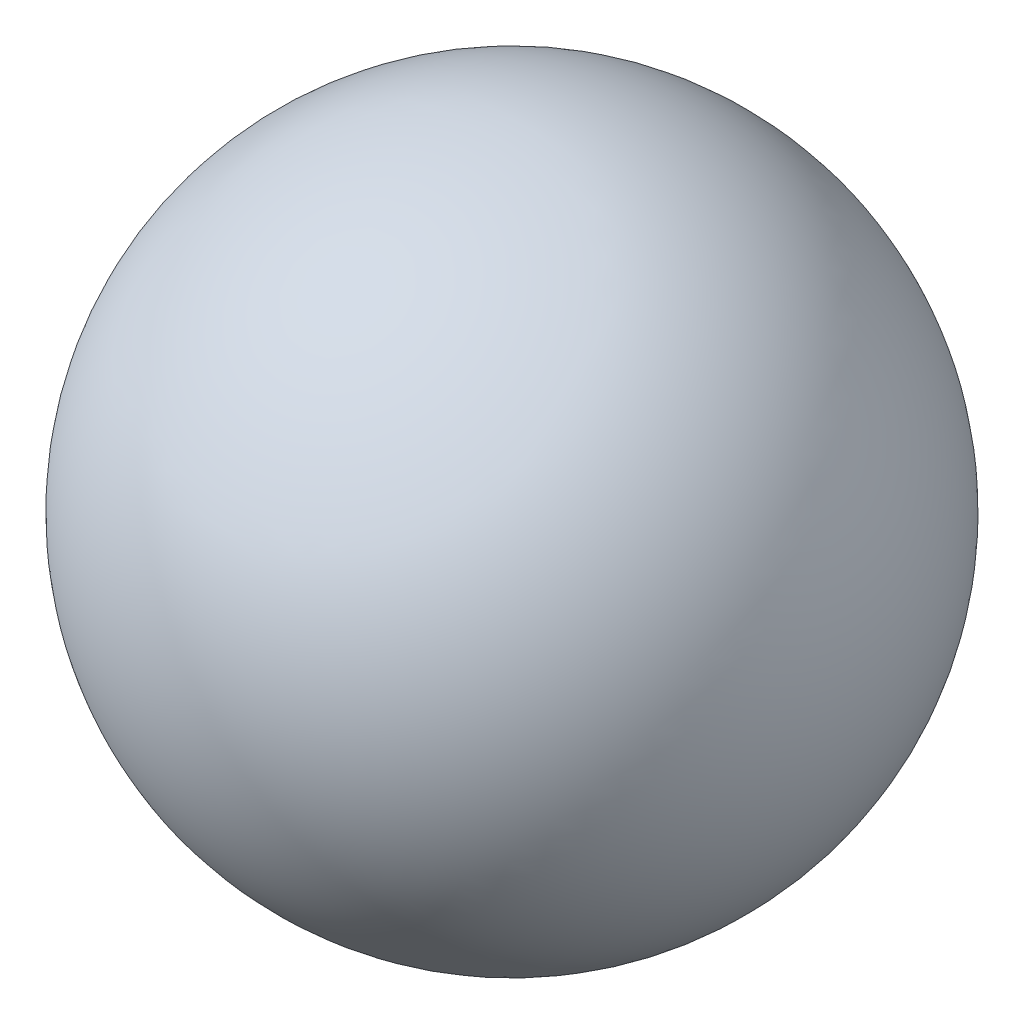
ISO-10303-21;
HEADER;
FILE_DESCRIPTION(('STEP AP214'),'2;1');
FILE_NAME('part.step','',(''),(''),'','','');
FILE_SCHEMA(('AUTOMOTIVE_DESIGN { 1 0 10303 214 1 1 1 1 }'));
ENDSEC;
DATA;
#1=APPLICATION_CONTEXT('core data for automotive mechanical design processes');
#2=APPLICATION_PROTOCOL_DEFINITION('international standard','automotive_design',2000,#1);
#3=PRODUCT_CONTEXT('',#1,'mechanical');
#4=PRODUCT('Part','Part','',(#3));
#5=PRODUCT_RELATED_PRODUCT_CATEGORY('part','',(#4));
#6=PRODUCT_DEFINITION_FORMATION('','',#4);
#7=PRODUCT_DEFINITION_CONTEXT('part definition',#1,'design');
#8=PRODUCT_DEFINITION('design','',#6,#7);
#9=PRODUCT_DEFINITION_SHAPE('','',#8);
#10=(LENGTH_UNIT() NAMED_UNIT(*) SI_UNIT(.MILLI.,.METRE.));
#11=(NAMED_UNIT(*) PLANE_ANGLE_UNIT() SI_UNIT($,.RADIAN.));
#12=(NAMED_UNIT(*) SI_UNIT($,.STERADIAN.) SOLID_ANGLE_UNIT());
#13=UNCERTAINTY_MEASURE_WITH_UNIT(LENGTH_MEASURE(1.E-05),#10,'distance_accuracy_value','');
#14=(GEOMETRIC_REPRESENTATION_CONTEXT(3) GLOBAL_UNCERTAINTY_ASSIGNED_CONTEXT((#13)) GLOBAL_UNIT_ASSIGNED_CONTEXT((#10,
#11,#12)) REPRESENTATION_CONTEXT('',''));
#15=CARTESIAN_POINT('',(0.,0.,0.));
#16=DIRECTION('',(0.,0.,1.));
#17=DIRECTION('',(1.,0.,0.));
#18=AXIS2_PLACEMENT_3D('',#15,#16,#17);
#19=CARTESIAN_POINT('',(0.,0.,0.));
#20=DIRECTION('',(0.,0.,-1.));
#21=DIRECTION('',(1.,0.,0.));
#22=AXIS2_PLACEMENT_3D('',#19,#20,#21);
#23=SPHERICAL_SURFACE('',#22,17.5);
#24=CARTESIAN_POINT('',(0.,0.,-17.5));
#25=VERTEX_POINT('',#24);
#26=VERTEX_LOOP('',#25);
#27=FACE_BOUND('',#26,.T.);
#28=ADVANCED_FACE('F31',(#27),#23,.T.);
#29=CLOSED_SHELL('',(#28));
#30=MANIFOLD_SOLID_BREP('B2',#29);
#31=ADVANCED_BREP_SHAPE_REPRESENTATION('',(#18,#30),#14);
#32=SHAPE_DEFINITION_REPRESENTATION(#9,#31);
ENDSEC;
END-ISO-10303-21;
